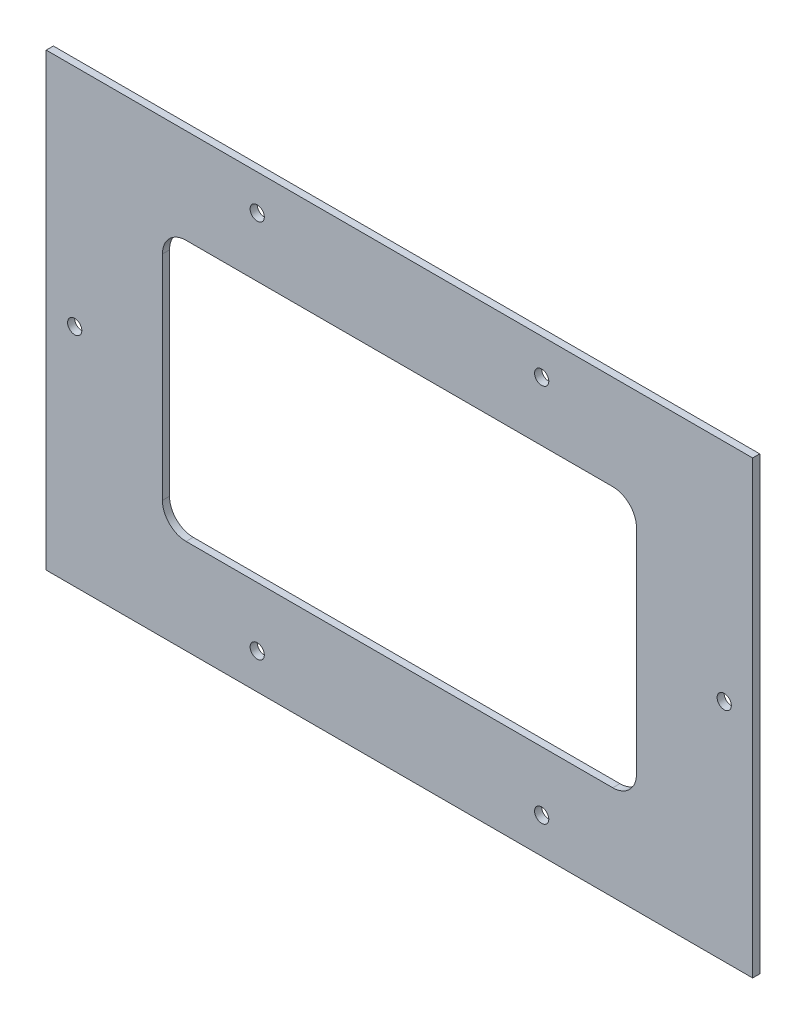
ISO-10303-21;
HEADER;
FILE_DESCRIPTION(('STEP AP214'),'2;1');
FILE_NAME('part.step','',(''),(''),'','','');
FILE_SCHEMA(('AUTOMOTIVE_DESIGN { 1 0 10303 214 1 1 1 1 }'));
ENDSEC;
DATA;
#1=APPLICATION_CONTEXT('core data for automotive mechanical design processes');
#2=APPLICATION_PROTOCOL_DEFINITION('international standard','automotive_design',2000,#1);
#3=PRODUCT_CONTEXT('',#1,'mechanical');
#4=PRODUCT('Part','Part','',(#3));
#5=PRODUCT_RELATED_PRODUCT_CATEGORY('part','',(#4));
#6=PRODUCT_DEFINITION_FORMATION('','',#4);
#7=PRODUCT_DEFINITION_CONTEXT('part definition',#1,'design');
#8=PRODUCT_DEFINITION('design','',#6,#7);
#9=PRODUCT_DEFINITION_SHAPE('','',#8);
#10=(LENGTH_UNIT() NAMED_UNIT(*) SI_UNIT(.MILLI.,.METRE.));
#11=(NAMED_UNIT(*) PLANE_ANGLE_UNIT() SI_UNIT($,.RADIAN.));
#12=(NAMED_UNIT(*) SI_UNIT($,.STERADIAN.) SOLID_ANGLE_UNIT());
#13=UNCERTAINTY_MEASURE_WITH_UNIT(LENGTH_MEASURE(1.E-05),#10,'distance_accuracy_value','');
#14=(GEOMETRIC_REPRESENTATION_CONTEXT(3) GLOBAL_UNCERTAINTY_ASSIGNED_CONTEXT((#13)) GLOBAL_UNIT_ASSIGNED_CONTEXT((#10,
#11,#12)) REPRESENTATION_CONTEXT('',''));
#15=CARTESIAN_POINT('',(0.,0.,0.));
#16=DIRECTION('',(0.,0.,1.));
#17=DIRECTION('',(1.,0.,0.));
#18=AXIS2_PLACEMENT_3D('',#15,#16,#17);
#19=CARTESIAN_POINT('',(0.,0.,1.5));
#20=DIRECTION('',(0.,0.,1.));
#21=DIRECTION('',(1.,0.,0.));
#22=AXIS2_PLACEMENT_3D('',#19,#20,#21);
#23=PLANE('',#22);
#24=DIRECTION('',(1.,0.,0.));
#25=VECTOR('',#24,1.);
#26=CARTESIAN_POINT('',(-74.5,155.,1.5));
#27=LINE('',#26,#25);
#28=CARTESIAN_POINT('',(-74.5,155.,1.5));
#29=VERTEX_POINT('',#28);
#30=CARTESIAN_POINT('',(74.5,155.,1.5));
#31=VERTEX_POINT('',#30);
#32=EDGE_CURVE('E47',#29,#31,#27,.T.);
#33=ORIENTED_EDGE('',*,*,#32,.F.);
#34=DIRECTION('',(0.,-1.,0.));
#35=VECTOR('',#34,1.);
#36=CARTESIAN_POINT('',(-74.5,165.,1.5));
#37=LINE('',#36,#35);
#38=CARTESIAN_POINT('',(-74.5,60.0000000000001,1.5));
#39=VERTEX_POINT('',#38);
#40=EDGE_CURVE('E135',#29,#39,#37,.T.);
#41=ORIENTED_EDGE('',*,*,#40,.T.);
#42=DIRECTION('',(-1.,0.,0.));
#43=VECTOR('',#42,1.);
#44=CARTESIAN_POINT('',(74.5,60.0000000000001,1.5));
#45=LINE('',#44,#43);
#46=CARTESIAN_POINT('',(74.5,60.0000000000001,1.5));
#47=VERTEX_POINT('',#46);
#48=EDGE_CURVE('E226',#47,#39,#45,.T.);
#49=ORIENTED_EDGE('',*,*,#48,.F.);
#50=DIRECTION('',(0.,1.,0.));
#51=VECTOR('',#50,1.);
#52=CARTESIAN_POINT('',(74.5,165.,1.5));
#53=LINE('',#52,#51);
#54=EDGE_CURVE('E147',#47,#31,#53,.T.);
#55=ORIENTED_EDGE('',*,*,#54,.T.);
#56=EDGE_LOOP('',(#33,#41,#49,#55));
#57=FACE_BOUND('',#56,.T.);
#58=CARTESIAN_POINT('',(68.5,107.5,1.5));
#59=DIRECTION('',(0.,0.,1.));
#60=DIRECTION('',(-1.,0.,0.));
#61=AXIS2_PLACEMENT_3D('',#58,#59,#60);
#62=CIRCLE('',#61,1.5);
#63=CARTESIAN_POINT('',(67.,107.5,1.5));
#64=VERTEX_POINT('',#63);
#65=EDGE_CURVE('E241',#64,#64,#62,.T.);
#66=ORIENTED_EDGE('',*,*,#65,.F.);
#67=EDGE_LOOP('',(#66));
#68=FACE_BOUND('',#67,.T.);
#69=CARTESIAN_POINT('',(-68.5,107.5,1.5));
#70=DIRECTION('',(0.,0.,1.));
#71=DIRECTION('',(1.,0.,0.));
#72=AXIS2_PLACEMENT_3D('',#69,#70,#71);
#73=CIRCLE('',#72,1.5);
#74=CARTESIAN_POINT('',(-67.,107.5,1.5));
#75=VERTEX_POINT('',#74);
#76=EDGE_CURVE('E240',#75,#75,#73,.T.);
#77=ORIENTED_EDGE('',*,*,#76,.F.);
#78=EDGE_LOOP('',(#77));
#79=FACE_BOUND('',#78,.T.);
#80=CARTESIAN_POINT('',(30.,147.5,1.5));
#81=DIRECTION('',(0.,0.,1.));
#82=DIRECTION('',(-1.,0.,0.));
#83=AXIS2_PLACEMENT_3D('',#80,#81,#82);
#84=CIRCLE('',#83,1.50000000000001);
#85=CARTESIAN_POINT('',(28.5,147.5,1.5));
#86=VERTEX_POINT('',#85);
#87=EDGE_CURVE('E230',#86,#86,#84,.T.);
#88=ORIENTED_EDGE('',*,*,#87,.F.);
#89=EDGE_LOOP('',(#88));
#90=FACE_BOUND('',#89,.T.);
#91=CARTESIAN_POINT('',(30.,67.5,1.5));
#92=DIRECTION('',(0.,0.,1.));
#93=DIRECTION('',(1.,0.,0.));
#94=AXIS2_PLACEMENT_3D('',#91,#92,#93);
#95=CIRCLE('',#94,1.50000000000001);
#96=CARTESIAN_POINT('',(31.5,67.5,1.5));
#97=VERTEX_POINT('',#96);
#98=EDGE_CURVE('E255',#97,#97,#95,.T.);
#99=ORIENTED_EDGE('',*,*,#98,.F.);
#100=EDGE_LOOP('',(#99));
#101=FACE_BOUND('',#100,.T.);
#102=CARTESIAN_POINT('',(-30.,67.5,1.5));
#103=DIRECTION('',(0.,0.,1.));
#104=DIRECTION('',(-1.,0.,0.));
#105=AXIS2_PLACEMENT_3D('',#102,#103,#104);
#106=CIRCLE('',#105,1.5);
#107=CARTESIAN_POINT('',(-31.5,67.5,1.5));
#108=VERTEX_POINT('',#107);
#109=EDGE_CURVE('E260',#108,#108,#106,.T.);
#110=ORIENTED_EDGE('',*,*,#109,.F.);
#111=EDGE_LOOP('',(#110));
#112=FACE_BOUND('',#111,.T.);
#113=CARTESIAN_POINT('',(-30.,147.5,1.5));
#114=DIRECTION('',(0.,0.,1.));
#115=DIRECTION('',(1.,0.,0.));
#116=AXIS2_PLACEMENT_3D('',#113,#114,#115);
#117=CIRCLE('',#116,1.5);
#118=CARTESIAN_POINT('',(-28.5,147.5,1.5));
#119=VERTEX_POINT('',#118);
#120=EDGE_CURVE('E213',#119,#119,#117,.T.);
#121=ORIENTED_EDGE('',*,*,#120,.F.);
#122=EDGE_LOOP('',(#121));
#123=FACE_BOUND('',#122,.T.);
#124=DIRECTION('',(1.,0.,0.));
#125=VECTOR('',#124,1.);
#126=CARTESIAN_POINT('',(-50.0000000000001,80.,1.5));
#127=LINE('',#126,#125);
#128=CARTESIAN_POINT('',(-45.0000000000001,80.,1.5));
#129=VERTEX_POINT('',#128);
#130=CARTESIAN_POINT('',(45.,80.,1.5));
#131=VERTEX_POINT('',#130);
#132=EDGE_CURVE('E204',#129,#131,#127,.T.);
#133=ORIENTED_EDGE('',*,*,#132,.F.);
#134=CARTESIAN_POINT('',(-45.0000000000001,85.,1.5));
#135=DIRECTION('',(0.,0.,1.));
#136=DIRECTION('',(1.,0.,0.));
#137=AXIS2_PLACEMENT_3D('',#134,#135,#136);
#138=CIRCLE('',#137,5.);
#139=CARTESIAN_POINT('',(-50.0000000000001,85.,1.5));
#140=VERTEX_POINT('',#139);
#141=EDGE_CURVE('E11',#129,#140,#138,.F.);
#142=ORIENTED_EDGE('',*,*,#141,.T.);
#143=DIRECTION('',(0.,-1.,0.));
#144=VECTOR('',#143,1.);
#145=CARTESIAN_POINT('',(-50.,135.,1.5));
#146=LINE('',#145,#144);
#147=CARTESIAN_POINT('',(-50.,130.,1.5));
#148=VERTEX_POINT('',#147);
#149=EDGE_CURVE('E202',#148,#140,#146,.T.);
#150=ORIENTED_EDGE('',*,*,#149,.F.);
#151=CARTESIAN_POINT('',(-45.,130.,1.5));
#152=DIRECTION('',(0.,0.,1.));
#153=DIRECTION('',(1.,0.,0.));
#154=AXIS2_PLACEMENT_3D('',#151,#152,#153);
#155=CIRCLE('',#154,5.);
#156=CARTESIAN_POINT('',(-45.,135.,1.5));
#157=VERTEX_POINT('',#156);
#158=EDGE_CURVE('E180',#148,#157,#155,.F.);
#159=ORIENTED_EDGE('',*,*,#158,.T.);
#160=DIRECTION('',(-1.,0.,0.));
#161=VECTOR('',#160,1.);
#162=CARTESIAN_POINT('',(-50.,135.,1.5));
#163=LINE('',#162,#161);
#164=CARTESIAN_POINT('',(45.,135.,1.5));
#165=VERTEX_POINT('',#164);
#166=EDGE_CURVE('E140',#165,#157,#163,.T.);
#167=ORIENTED_EDGE('',*,*,#166,.F.);
#168=CARTESIAN_POINT('',(45.,130.,1.5));
#169=DIRECTION('',(0.,0.,1.));
#170=DIRECTION('',(1.,0.,0.));
#171=AXIS2_PLACEMENT_3D('',#168,#169,#170);
#172=CIRCLE('',#171,5.);
#173=CARTESIAN_POINT('',(50.,130.,1.5));
#174=VERTEX_POINT('',#173);
#175=EDGE_CURVE('E176',#165,#174,#172,.F.);
#176=ORIENTED_EDGE('',*,*,#175,.T.);
#177=DIRECTION('',(0.,1.,0.));
#178=VECTOR('',#177,1.);
#179=CARTESIAN_POINT('',(50.,135.,1.5));
#180=LINE('',#179,#178);
#181=CARTESIAN_POINT('',(50.,85.,1.5));
#182=VERTEX_POINT('',#181);
#183=EDGE_CURVE('E144',#182,#174,#180,.T.);
#184=ORIENTED_EDGE('',*,*,#183,.F.);
#185=CARTESIAN_POINT('',(45.,85.,1.5));
#186=DIRECTION('',(0.,0.,1.));
#187=DIRECTION('',(1.,0.,0.));
#188=AXIS2_PLACEMENT_3D('',#185,#186,#187);
#189=CIRCLE('',#188,5.);
#190=EDGE_CURVE('E172',#182,#131,#189,.F.);
#191=ORIENTED_EDGE('',*,*,#190,.T.);
#192=EDGE_LOOP('',(#133,#142,#150,#159,#167,#176,#184,#191));
#193=FACE_BOUND('',#192,.T.);
#194=ADVANCED_FACE('F32',(#57,#68,#79,#90,#101,#112,#123,#193),#23,.T.);
#195=CARTESIAN_POINT('',(0.,0.,0.));
#196=DIRECTION('',(0.,0.,1.));
#197=DIRECTION('',(1.,0.,0.));
#198=AXIS2_PLACEMENT_3D('',#195,#196,#197);
#199=PLANE('',#198);
#200=CARTESIAN_POINT('',(68.5,107.5,0.));
#201=DIRECTION('',(0.,0.,1.));
#202=DIRECTION('',(-1.,0.,0.));
#203=AXIS2_PLACEMENT_3D('',#200,#201,#202);
#204=CIRCLE('',#203,1.5);
#205=CARTESIAN_POINT('',(67.,107.5,0.));
#206=VERTEX_POINT('',#205);
#207=EDGE_CURVE('E237',#206,#206,#204,.T.);
#208=ORIENTED_EDGE('',*,*,#207,.T.);
#209=EDGE_LOOP('',(#208));
#210=FACE_BOUND('',#209,.T.);
#211=CARTESIAN_POINT('',(-68.5,107.5,0.));
#212=DIRECTION('',(0.,0.,1.));
#213=DIRECTION('',(1.,0.,0.));
#214=AXIS2_PLACEMENT_3D('',#211,#212,#213);
#215=CIRCLE('',#214,1.5);
#216=CARTESIAN_POINT('',(-67.,107.5,0.));
#217=VERTEX_POINT('',#216);
#218=EDGE_CURVE('E246',#217,#217,#215,.T.);
#219=ORIENTED_EDGE('',*,*,#218,.T.);
#220=EDGE_LOOP('',(#219));
#221=FACE_BOUND('',#220,.T.);
#222=CARTESIAN_POINT('',(30.,147.5,0.));
#223=DIRECTION('',(0.,0.,1.));
#224=DIRECTION('',(-1.,0.,0.));
#225=AXIS2_PLACEMENT_3D('',#222,#223,#224);
#226=CIRCLE('',#225,1.50000000000001);
#227=CARTESIAN_POINT('',(28.5,147.5,0.));
#228=VERTEX_POINT('',#227);
#229=EDGE_CURVE('E233',#228,#228,#226,.T.);
#230=ORIENTED_EDGE('',*,*,#229,.T.);
#231=EDGE_LOOP('',(#230));
#232=FACE_BOUND('',#231,.T.);
#233=CARTESIAN_POINT('',(30.,67.5,0.));
#234=DIRECTION('',(0.,0.,1.));
#235=DIRECTION('',(1.,0.,0.));
#236=AXIS2_PLACEMENT_3D('',#233,#234,#235);
#237=CIRCLE('',#236,1.50000000000001);
#238=CARTESIAN_POINT('',(31.5,67.5,0.));
#239=VERTEX_POINT('',#238);
#240=EDGE_CURVE('E257',#239,#239,#237,.T.);
#241=ORIENTED_EDGE('',*,*,#240,.T.);
#242=EDGE_LOOP('',(#241));
#243=FACE_BOUND('',#242,.T.);
#244=CARTESIAN_POINT('',(-30.,67.5,0.));
#245=DIRECTION('',(0.,0.,1.));
#246=DIRECTION('',(-1.,0.,0.));
#247=AXIS2_PLACEMENT_3D('',#244,#245,#246);
#248=CIRCLE('',#247,1.5);
#249=CARTESIAN_POINT('',(-31.5,67.5,0.));
#250=VERTEX_POINT('',#249);
#251=EDGE_CURVE('E263',#250,#250,#248,.T.);
#252=ORIENTED_EDGE('',*,*,#251,.T.);
#253=EDGE_LOOP('',(#252));
#254=FACE_BOUND('',#253,.T.);
#255=CARTESIAN_POINT('',(-30.,147.5,0.));
#256=DIRECTION('',(0.,0.,1.));
#257=DIRECTION('',(1.,0.,0.));
#258=AXIS2_PLACEMENT_3D('',#255,#256,#257);
#259=CIRCLE('',#258,1.5);
#260=CARTESIAN_POINT('',(-28.5,147.5,0.));
#261=VERTEX_POINT('',#260);
#262=EDGE_CURVE('E218',#261,#261,#259,.T.);
#263=ORIENTED_EDGE('',*,*,#262,.T.);
#264=EDGE_LOOP('',(#263));
#265=FACE_BOUND('',#264,.T.);
#266=DIRECTION('',(0.,-1.,0.));
#267=VECTOR('',#266,1.);
#268=CARTESIAN_POINT('',(-74.5,165.,0.));
#269=LINE('',#268,#267);
#270=CARTESIAN_POINT('',(-74.5,155.,0.));
#271=VERTEX_POINT('',#270);
#272=CARTESIAN_POINT('',(-74.5,60.0000000000001,0.));
#273=VERTEX_POINT('',#272);
#274=EDGE_CURVE('E133',#271,#273,#269,.T.);
#275=ORIENTED_EDGE('',*,*,#274,.F.);
#276=DIRECTION('',(1.,0.,0.));
#277=VECTOR('',#276,1.);
#278=CARTESIAN_POINT('',(-74.5,155.,0.));
#279=LINE('',#278,#277);
#280=CARTESIAN_POINT('',(74.5,155.,0.));
#281=VERTEX_POINT('',#280);
#282=EDGE_CURVE('E118',#271,#281,#279,.T.);
#283=ORIENTED_EDGE('',*,*,#282,.T.);
#284=DIRECTION('',(0.,1.,0.));
#285=VECTOR('',#284,1.);
#286=CARTESIAN_POINT('',(74.5,165.,0.));
#287=LINE('',#286,#285);
#288=CARTESIAN_POINT('',(74.5,60.0000000000001,0.));
#289=VERTEX_POINT('',#288);
#290=EDGE_CURVE('E139',#289,#281,#287,.T.);
#291=ORIENTED_EDGE('',*,*,#290,.F.);
#292=DIRECTION('',(-1.,0.,0.));
#293=VECTOR('',#292,1.);
#294=CARTESIAN_POINT('',(74.5,60.0000000000001,0.));
#295=LINE('',#294,#293);
#296=EDGE_CURVE('E55',#289,#273,#295,.T.);
#297=ORIENTED_EDGE('',*,*,#296,.T.);
#298=EDGE_LOOP('',(#275,#283,#291,#297));
#299=FACE_BOUND('',#298,.T.);
#300=DIRECTION('',(-1.,0.,0.));
#301=VECTOR('',#300,1.);
#302=CARTESIAN_POINT('',(-50.,135.,0.));
#303=LINE('',#302,#301);
#304=CARTESIAN_POINT('',(45.,135.,0.));
#305=VERTEX_POINT('',#304);
#306=CARTESIAN_POINT('',(-45.,135.,0.));
#307=VERTEX_POINT('',#306);
#308=EDGE_CURVE('E208',#305,#307,#303,.T.);
#309=ORIENTED_EDGE('',*,*,#308,.T.);
#310=CARTESIAN_POINT('',(-45.,130.,0.));
#311=DIRECTION('',(0.,0.,1.));
#312=DIRECTION('',(1.,0.,0.));
#313=AXIS2_PLACEMENT_3D('',#310,#311,#312);
#314=CIRCLE('',#313,5.);
#315=CARTESIAN_POINT('',(-50.,130.,0.));
#316=VERTEX_POINT('',#315);
#317=EDGE_CURVE('E178',#307,#316,#314,.T.);
#318=ORIENTED_EDGE('',*,*,#317,.T.);
#319=DIRECTION('',(0.,-1.,0.));
#320=VECTOR('',#319,1.);
#321=CARTESIAN_POINT('',(-50.,135.,0.));
#322=LINE('',#321,#320);
#323=CARTESIAN_POINT('',(-50.0000000000001,85.,0.));
#324=VERTEX_POINT('',#323);
#325=EDGE_CURVE('E187',#316,#324,#322,.T.);
#326=ORIENTED_EDGE('',*,*,#325,.T.);
#327=CARTESIAN_POINT('',(-45.0000000000001,85.,0.));
#328=DIRECTION('',(0.,0.,1.));
#329=DIRECTION('',(1.,0.,0.));
#330=AXIS2_PLACEMENT_3D('',#327,#328,#329);
#331=CIRCLE('',#330,5.);
#332=CARTESIAN_POINT('',(-45.0000000000001,80.,0.));
#333=VERTEX_POINT('',#332);
#334=EDGE_CURVE('E40',#324,#333,#331,.T.);
#335=ORIENTED_EDGE('',*,*,#334,.T.);
#336=DIRECTION('',(1.,0.,0.));
#337=VECTOR('',#336,1.);
#338=CARTESIAN_POINT('',(-50.0000000000001,80.,0.));
#339=LINE('',#338,#337);
#340=CARTESIAN_POINT('',(45.,80.,0.));
#341=VERTEX_POINT('',#340);
#342=EDGE_CURVE('E185',#333,#341,#339,.T.);
#343=ORIENTED_EDGE('',*,*,#342,.T.);
#344=CARTESIAN_POINT('',(45.,85.,0.));
#345=DIRECTION('',(0.,0.,1.));
#346=DIRECTION('',(1.,0.,0.));
#347=AXIS2_PLACEMENT_3D('',#344,#345,#346);
#348=CIRCLE('',#347,5.);
#349=CARTESIAN_POINT('',(50.,85.,0.));
#350=VERTEX_POINT('',#349);
#351=EDGE_CURVE('E170',#341,#350,#348,.T.);
#352=ORIENTED_EDGE('',*,*,#351,.T.);
#353=DIRECTION('',(0.,1.,0.));
#354=VECTOR('',#353,1.);
#355=CARTESIAN_POINT('',(50.,135.,0.));
#356=LINE('',#355,#354);
#357=CARTESIAN_POINT('',(50.,130.,0.));
#358=VERTEX_POINT('',#357);
#359=EDGE_CURVE('E196',#350,#358,#356,.T.);
#360=ORIENTED_EDGE('',*,*,#359,.T.);
#361=CARTESIAN_POINT('',(45.,130.,0.));
#362=DIRECTION('',(0.,0.,1.));
#363=DIRECTION('',(1.,0.,0.));
#364=AXIS2_PLACEMENT_3D('',#361,#362,#363);
#365=CIRCLE('',#364,5.);
#366=EDGE_CURVE('E174',#358,#305,#365,.T.);
#367=ORIENTED_EDGE('',*,*,#366,.T.);
#368=EDGE_LOOP('',(#309,#318,#326,#335,#343,#352,#360,#367));
#369=FACE_BOUND('',#368,.T.);
#370=ADVANCED_FACE('F137',(#210,#221,#232,#243,#254,#265,#299,#369),#199,.F.);
#371=CARTESIAN_POINT('',(-74.5,165.,1.5));
#372=DIRECTION('',(1.,0.,0.));
#373=DIRECTION('',(0.,1.,0.));
#374=AXIS2_PLACEMENT_3D('',#371,#372,#373);
#375=PLANE('',#374);
#376=ORIENTED_EDGE('',*,*,#40,.F.);
#377=DIRECTION('',(0.,0.,1.));
#378=VECTOR('',#377,1.);
#379=CARTESIAN_POINT('',(-74.5,155.,0.));
#380=LINE('',#379,#378);
#381=EDGE_CURVE('E121',#271,#29,#380,.T.);
#382=ORIENTED_EDGE('',*,*,#381,.F.);
#383=ORIENTED_EDGE('',*,*,#274,.T.);
#384=DIRECTION('',(0.,0.,1.));
#385=VECTOR('',#384,1.);
#386=CARTESIAN_POINT('',(-74.5,60.0000000000001,0.));
#387=LINE('',#386,#385);
#388=EDGE_CURVE('E247',#273,#39,#387,.T.);
#389=ORIENTED_EDGE('',*,*,#388,.T.);
#390=EDGE_LOOP('',(#376,#382,#383,#389));
#391=FACE_BOUND('',#390,.T.);
#392=ADVANCED_FACE('F131',(#391),#375,.F.);
#393=CARTESIAN_POINT('',(74.5,165.,1.5));
#394=DIRECTION('',(-1.,0.,0.));
#395=DIRECTION('',(0.,-1.,0.));
#396=AXIS2_PLACEMENT_3D('',#393,#394,#395);
#397=PLANE('',#396);
#398=ORIENTED_EDGE('',*,*,#290,.T.);
#399=DIRECTION('',(0.,0.,1.));
#400=VECTOR('',#399,1.);
#401=CARTESIAN_POINT('',(74.5,155.,0.));
#402=LINE('',#401,#400);
#403=EDGE_CURVE('E122',#281,#31,#402,.T.);
#404=ORIENTED_EDGE('',*,*,#403,.T.);
#405=ORIENTED_EDGE('',*,*,#54,.F.);
#406=DIRECTION('',(0.,0.,1.));
#407=VECTOR('',#406,1.);
#408=CARTESIAN_POINT('',(74.5,60.0000000000001,0.));
#409=LINE('',#408,#407);
#410=EDGE_CURVE('E229',#289,#47,#409,.T.);
#411=ORIENTED_EDGE('',*,*,#410,.F.);
#412=EDGE_LOOP('',(#398,#404,#405,#411));
#413=FACE_BOUND('',#412,.T.);
#414=ADVANCED_FACE('F228',(#413),#397,.F.);
#415=CARTESIAN_POINT('',(-50.,135.,1.5));
#416=DIRECTION('',(1.,0.,0.));
#417=DIRECTION('',(0.,1.,0.));
#418=AXIS2_PLACEMENT_3D('',#415,#416,#417);
#419=PLANE('',#418);
#420=ORIENTED_EDGE('',*,*,#325,.F.);
#421=DIRECTION('',(0.,0.,-1.));
#422=VECTOR('',#421,1.);
#423=CARTESIAN_POINT('',(-50.,130.,1.5));
#424=LINE('',#423,#422);
#425=EDGE_CURVE('E168',#316,#148,#424,.F.);
#426=ORIENTED_EDGE('',*,*,#425,.T.);
#427=ORIENTED_EDGE('',*,*,#149,.T.);
#428=DIRECTION('',(0.,0.,-1.));
#429=VECTOR('',#428,1.);
#430=CARTESIAN_POINT('',(-50.0000000000001,85.,0.));
#431=LINE('',#430,#429);
#432=EDGE_CURVE('E165',#140,#324,#431,.T.);
#433=ORIENTED_EDGE('',*,*,#432,.T.);
#434=EDGE_LOOP('',(#420,#426,#427,#433));
#435=FACE_BOUND('',#434,.T.);
#436=ADVANCED_FACE('F206',(#435),#419,.T.);
#437=CARTESIAN_POINT('',(-50.0000000000001,80.,1.5));
#438=DIRECTION('',(0.,1.,0.));
#439=DIRECTION('',(-1.,0.,0.));
#440=AXIS2_PLACEMENT_3D('',#437,#438,#439);
#441=PLANE('',#440);
#442=ORIENTED_EDGE('',*,*,#132,.T.);
#443=DIRECTION('',(0.,0.,-1.));
#444=VECTOR('',#443,1.);
#445=CARTESIAN_POINT('',(45.,80.,0.));
#446=LINE('',#445,#444);
#447=EDGE_CURVE('E152',#131,#341,#446,.T.);
#448=ORIENTED_EDGE('',*,*,#447,.T.);
#449=ORIENTED_EDGE('',*,*,#342,.F.);
#450=DIRECTION('',(0.,0.,-1.));
#451=VECTOR('',#450,1.);
#452=CARTESIAN_POINT('',(-45.0000000000001,80.,1.5));
#453=LINE('',#452,#451);
#454=EDGE_CURVE('E150',#333,#129,#453,.F.);
#455=ORIENTED_EDGE('',*,*,#454,.T.);
#456=EDGE_LOOP('',(#442,#448,#449,#455));
#457=FACE_BOUND('',#456,.T.);
#458=ADVANCED_FACE('F193',(#457),#441,.T.);
#459=CARTESIAN_POINT('',(50.,135.,1.5));
#460=DIRECTION('',(-1.,0.,0.));
#461=DIRECTION('',(0.,-1.,0.));
#462=AXIS2_PLACEMENT_3D('',#459,#460,#461);
#463=PLANE('',#462);
#464=ORIENTED_EDGE('',*,*,#359,.F.);
#465=DIRECTION('',(0.,0.,-1.));
#466=VECTOR('',#465,1.);
#467=CARTESIAN_POINT('',(50.,85.,1.5));
#468=LINE('',#467,#466);
#469=EDGE_CURVE('E158',#350,#182,#468,.F.);
#470=ORIENTED_EDGE('',*,*,#469,.T.);
#471=ORIENTED_EDGE('',*,*,#183,.T.);
#472=DIRECTION('',(0.,0.,-1.));
#473=VECTOR('',#472,1.);
#474=CARTESIAN_POINT('',(50.,130.,0.));
#475=LINE('',#474,#473);
#476=EDGE_CURVE('E155',#174,#358,#475,.T.);
#477=ORIENTED_EDGE('',*,*,#476,.T.);
#478=EDGE_LOOP('',(#464,#470,#471,#477));
#479=FACE_BOUND('',#478,.T.);
#480=ADVANCED_FACE('F314',(#479),#463,.T.);
#481=CARTESIAN_POINT('',(-50.,135.,1.5));
#482=DIRECTION('',(0.,-1.,0.));
#483=DIRECTION('',(1.,0.,0.));
#484=AXIS2_PLACEMENT_3D('',#481,#482,#483);
#485=PLANE('',#484);
#486=ORIENTED_EDGE('',*,*,#308,.F.);
#487=DIRECTION('',(0.,0.,-1.));
#488=VECTOR('',#487,1.);
#489=CARTESIAN_POINT('',(45.,135.,1.5));
#490=LINE('',#489,#488);
#491=EDGE_CURVE('E163',#305,#165,#490,.F.);
#492=ORIENTED_EDGE('',*,*,#491,.T.);
#493=ORIENTED_EDGE('',*,*,#166,.T.);
#494=DIRECTION('',(0.,0.,-1.));
#495=VECTOR('',#494,1.);
#496=CARTESIAN_POINT('',(-45.,135.,0.));
#497=LINE('',#496,#495);
#498=EDGE_CURVE('E160',#157,#307,#497,.T.);
#499=ORIENTED_EDGE('',*,*,#498,.T.);
#500=EDGE_LOOP('',(#486,#492,#493,#499));
#501=FACE_BOUND('',#500,.T.);
#502=ADVANCED_FACE('F293',(#501),#485,.T.);
#503=CARTESIAN_POINT('',(45.,85.,1.5));
#504=DIRECTION('',(0.,0.,1.));
#505=DIRECTION('',(1.,0.,0.));
#506=AXIS2_PLACEMENT_3D('',#503,#504,#505);
#507=CYLINDRICAL_SURFACE('',#506,5.);
#508=ORIENTED_EDGE('',*,*,#190,.F.);
#509=ORIENTED_EDGE('',*,*,#469,.F.);
#510=ORIENTED_EDGE('',*,*,#351,.F.);
#511=ORIENTED_EDGE('',*,*,#447,.F.);
#512=EDGE_LOOP('',(#508,#509,#510,#511));
#513=FACE_BOUND('',#512,.T.);
#514=ADVANCED_FACE('F289',(#513),#507,.F.);
#515=CARTESIAN_POINT('',(45.,130.,1.5));
#516=DIRECTION('',(0.,0.,1.));
#517=DIRECTION('',(1.,0.,0.));
#518=AXIS2_PLACEMENT_3D('',#515,#516,#517);
#519=CYLINDRICAL_SURFACE('',#518,5.);
#520=ORIENTED_EDGE('',*,*,#175,.F.);
#521=ORIENTED_EDGE('',*,*,#491,.F.);
#522=ORIENTED_EDGE('',*,*,#366,.F.);
#523=ORIENTED_EDGE('',*,*,#476,.F.);
#524=EDGE_LOOP('',(#520,#521,#522,#523));
#525=FACE_BOUND('',#524,.T.);
#526=ADVANCED_FACE('F292',(#525),#519,.F.);
#527=CARTESIAN_POINT('',(-45.,130.,1.5));
#528=DIRECTION('',(0.,0.,1.));
#529=DIRECTION('',(1.,0.,0.));
#530=AXIS2_PLACEMENT_3D('',#527,#528,#529);
#531=CYLINDRICAL_SURFACE('',#530,5.);
#532=ORIENTED_EDGE('',*,*,#158,.F.);
#533=ORIENTED_EDGE('',*,*,#425,.F.);
#534=ORIENTED_EDGE('',*,*,#317,.F.);
#535=ORIENTED_EDGE('',*,*,#498,.F.);
#536=EDGE_LOOP('',(#532,#533,#534,#535));
#537=FACE_BOUND('',#536,.T.);
#538=ADVANCED_FACE('F296',(#537),#531,.F.);
#539=CARTESIAN_POINT('',(-45.0000000000001,85.,1.5));
#540=DIRECTION('',(0.,0.,1.));
#541=DIRECTION('',(1.,0.,0.));
#542=AXIS2_PLACEMENT_3D('',#539,#540,#541);
#543=CYLINDRICAL_SURFACE('',#542,5.);
#544=ORIENTED_EDGE('',*,*,#141,.F.);
#545=ORIENTED_EDGE('',*,*,#454,.F.);
#546=ORIENTED_EDGE('',*,*,#334,.F.);
#547=ORIENTED_EDGE('',*,*,#432,.F.);
#548=EDGE_LOOP('',(#544,#545,#546,#547));
#549=FACE_BOUND('',#548,.T.);
#550=ADVANCED_FACE('F34',(#549),#543,.F.);
#551=CARTESIAN_POINT('',(-30.,147.5,0.));
#552=DIRECTION('',(0.,0.,1.));
#553=DIRECTION('',(1.,0.,0.));
#554=AXIS2_PLACEMENT_3D('',#551,#552,#553);
#555=CYLINDRICAL_SURFACE('',#554,1.5);
#556=ORIENTED_EDGE('',*,*,#262,.F.);
#557=EDGE_LOOP('',(#556));
#558=FACE_BOUND('',#557,.T.);
#559=ORIENTED_EDGE('',*,*,#120,.T.);
#560=EDGE_LOOP('',(#559));
#561=FACE_BOUND('',#560,.T.);
#562=ADVANCED_FACE('F273',(#558,#561),#555,.F.);
#563=CARTESIAN_POINT('',(-30.,67.5,0.));
#564=DIRECTION('',(0.,0.,1.));
#565=DIRECTION('',(1.,0.,0.));
#566=AXIS2_PLACEMENT_3D('',#563,#564,#565);
#567=CYLINDRICAL_SURFACE('',#566,1.5);
#568=ORIENTED_EDGE('',*,*,#251,.F.);
#569=EDGE_LOOP('',(#568));
#570=FACE_BOUND('',#569,.T.);
#571=ORIENTED_EDGE('',*,*,#109,.T.);
#572=EDGE_LOOP('',(#571));
#573=FACE_BOUND('',#572,.T.);
#574=ADVANCED_FACE('F326',(#570,#573),#567,.F.);
#575=CARTESIAN_POINT('',(30.,67.5,0.));
#576=DIRECTION('',(0.,0.,1.));
#577=DIRECTION('',(1.,0.,0.));
#578=AXIS2_PLACEMENT_3D('',#575,#576,#577);
#579=CYLINDRICAL_SURFACE('',#578,1.50000000000001);
#580=ORIENTED_EDGE('',*,*,#240,.F.);
#581=EDGE_LOOP('',(#580));
#582=FACE_BOUND('',#581,.T.);
#583=ORIENTED_EDGE('',*,*,#98,.T.);
#584=EDGE_LOOP('',(#583));
#585=FACE_BOUND('',#584,.T.);
#586=ADVANCED_FACE('F330',(#582,#585),#579,.F.);
#587=CARTESIAN_POINT('',(30.,147.5,0.));
#588=DIRECTION('',(0.,0.,1.));
#589=DIRECTION('',(1.,0.,0.));
#590=AXIS2_PLACEMENT_3D('',#587,#588,#589);
#591=CYLINDRICAL_SURFACE('',#590,1.50000000000001);
#592=ORIENTED_EDGE('',*,*,#229,.F.);
#593=EDGE_LOOP('',(#592));
#594=FACE_BOUND('',#593,.T.);
#595=ORIENTED_EDGE('',*,*,#87,.T.);
#596=EDGE_LOOP('',(#595));
#597=FACE_BOUND('',#596,.T.);
#598=ADVANCED_FACE('F334',(#594,#597),#591,.F.);
#599=CARTESIAN_POINT('',(74.5,60.0000000000001,0.));
#600=DIRECTION('',(0.,1.,0.));
#601=DIRECTION('',(0.,0.,1.));
#602=AXIS2_PLACEMENT_3D('',#599,#600,#601);
#603=PLANE('',#602);
#604=ORIENTED_EDGE('',*,*,#48,.T.);
#605=ORIENTED_EDGE('',*,*,#388,.F.);
#606=ORIENTED_EDGE('',*,*,#296,.F.);
#607=ORIENTED_EDGE('',*,*,#410,.T.);
#608=EDGE_LOOP('',(#604,#605,#606,#607));
#609=FACE_BOUND('',#608,.T.);
#610=ADVANCED_FACE('F338',(#609),#603,.F.);
#611=CARTESIAN_POINT('',(-74.5,155.,0.));
#612=DIRECTION('',(0.,-1.,0.));
#613=DIRECTION('',(0.,0.,-1.));
#614=AXIS2_PLACEMENT_3D('',#611,#612,#613);
#615=PLANE('',#614);
#616=ORIENTED_EDGE('',*,*,#32,.T.);
#617=ORIENTED_EDGE('',*,*,#403,.F.);
#618=ORIENTED_EDGE('',*,*,#282,.F.);
#619=ORIENTED_EDGE('',*,*,#381,.T.);
#620=EDGE_LOOP('',(#616,#617,#618,#619));
#621=FACE_BOUND('',#620,.T.);
#622=ADVANCED_FACE('F120',(#621),#615,.F.);
#623=CARTESIAN_POINT('',(-68.5,107.5,0.));
#624=DIRECTION('',(0.,0.,1.));
#625=DIRECTION('',(1.,0.,0.));
#626=AXIS2_PLACEMENT_3D('',#623,#624,#625);
#627=CYLINDRICAL_SURFACE('',#626,1.5);
#628=ORIENTED_EDGE('',*,*,#218,.F.);
#629=EDGE_LOOP('',(#628));
#630=FACE_BOUND('',#629,.T.);
#631=ORIENTED_EDGE('',*,*,#76,.T.);
#632=EDGE_LOOP('',(#631));
#633=FACE_BOUND('',#632,.T.);
#634=ADVANCED_FACE('F340',(#630,#633),#627,.F.);
#635=CARTESIAN_POINT('',(68.5,107.5,0.));
#636=DIRECTION('',(0.,0.,1.));
#637=DIRECTION('',(1.,0.,0.));
#638=AXIS2_PLACEMENT_3D('',#635,#636,#637);
#639=CYLINDRICAL_SURFACE('',#638,1.5);
#640=ORIENTED_EDGE('',*,*,#207,.F.);
#641=EDGE_LOOP('',(#640));
#642=FACE_BOUND('',#641,.T.);
#643=ORIENTED_EDGE('',*,*,#65,.T.);
#644=EDGE_LOOP('',(#643));
#645=FACE_BOUND('',#644,.T.);
#646=ADVANCED_FACE('F343',(#642,#645),#639,.F.);
#647=CLOSED_SHELL('',(#194,#370,#392,#414,#436,#458,#480,#502,#514,#526,#538,#550,#562,#574,
#586,#598,#610,#622,#634,#646));
#648=MANIFOLD_SOLID_BREP('B2',#647);
#649=ADVANCED_BREP_SHAPE_REPRESENTATION('',(#18,#648),#14);
#650=SHAPE_DEFINITION_REPRESENTATION(#9,#649);
ENDSEC;
END-ISO-10303-21;
